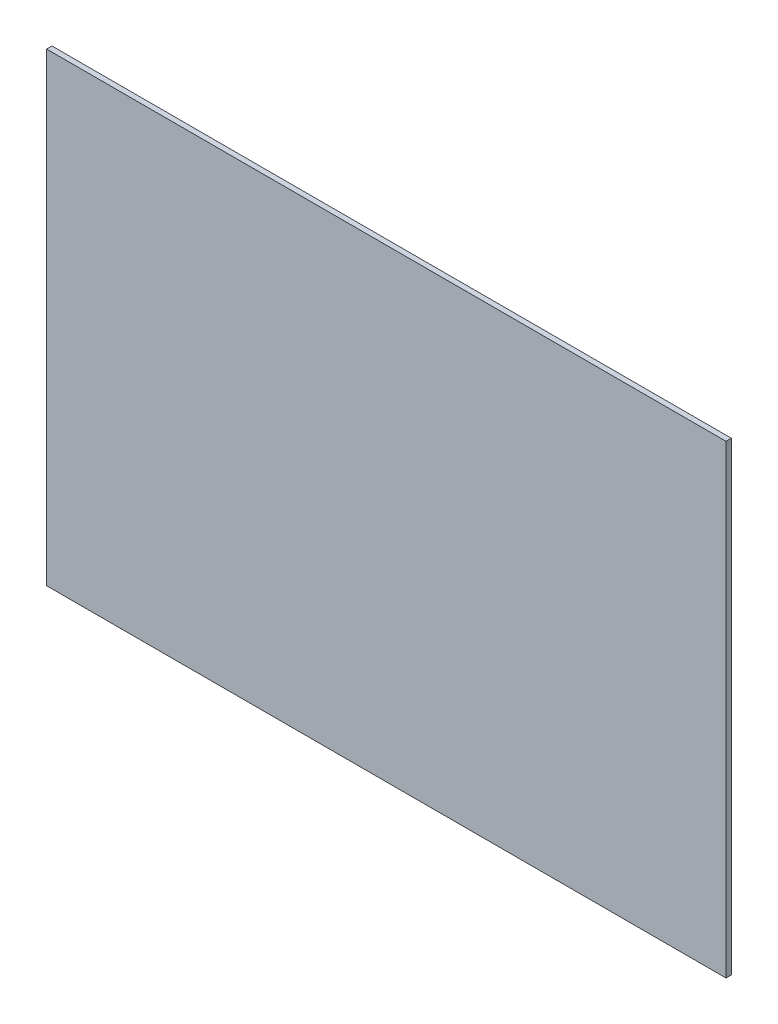
ISO-10303-21;
HEADER;
FILE_DESCRIPTION(('STEP AP214'),'2;1');
FILE_NAME('part.step','',(''),(''),'','','');
FILE_SCHEMA(('AUTOMOTIVE_DESIGN { 1 0 10303 214 1 1 1 1 }'));
ENDSEC;
DATA;
#1=APPLICATION_CONTEXT('core data for automotive mechanical design processes');
#2=APPLICATION_PROTOCOL_DEFINITION('international standard','automotive_design',2000,#1);
#3=PRODUCT_CONTEXT('',#1,'mechanical');
#4=PRODUCT('Part','Part','',(#3));
#5=PRODUCT_RELATED_PRODUCT_CATEGORY('part','',(#4));
#6=PRODUCT_DEFINITION_FORMATION('','',#4);
#7=PRODUCT_DEFINITION_CONTEXT('part definition',#1,'design');
#8=PRODUCT_DEFINITION('design','',#6,#7);
#9=PRODUCT_DEFINITION_SHAPE('','',#8);
#10=(LENGTH_UNIT() NAMED_UNIT(*) SI_UNIT(.MILLI.,.METRE.));
#11=(NAMED_UNIT(*) PLANE_ANGLE_UNIT() SI_UNIT($,.RADIAN.));
#12=(NAMED_UNIT(*) SI_UNIT($,.STERADIAN.) SOLID_ANGLE_UNIT());
#13=UNCERTAINTY_MEASURE_WITH_UNIT(LENGTH_MEASURE(1.E-05),#10,'distance_accuracy_value','');
#14=(GEOMETRIC_REPRESENTATION_CONTEXT(3) GLOBAL_UNCERTAINTY_ASSIGNED_CONTEXT((#13)) GLOBAL_UNIT_ASSIGNED_CONTEXT((#10,
#11,#12)) REPRESENTATION_CONTEXT('',''));
#15=CARTESIAN_POINT('',(0.,0.,0.));
#16=DIRECTION('',(0.,0.,1.));
#17=DIRECTION('',(1.,0.,0.));
#18=AXIS2_PLACEMENT_3D('',#15,#16,#17);
#19=CARTESIAN_POINT('',(0.,0.,3.));
#20=DIRECTION('',(1.,0.,0.));
#21=DIRECTION('',(0.,0.,-1.));
#22=AXIS2_PLACEMENT_3D('',#19,#20,#21);
#23=PLANE('',#22);
#24=DIRECTION('',(0.,-1.,0.));
#25=VECTOR('',#24,1.);
#26=CARTESIAN_POINT('',(0.,0.,0.));
#27=LINE('',#26,#25);
#28=CARTESIAN_POINT('',(0.,261.3,0.));
#29=VERTEX_POINT('',#28);
#30=CARTESIAN_POINT('',(0.,0.,0.));
#31=VERTEX_POINT('',#30);
#32=EDGE_CURVE('E96',#29,#31,#27,.T.);
#33=ORIENTED_EDGE('',*,*,#32,.T.);
#34=DIRECTION('',(0.,0.,-1.));
#35=VECTOR('',#34,1.);
#36=CARTESIAN_POINT('',(0.,0.,3.));
#37=LINE('',#36,#35);
#38=CARTESIAN_POINT('',(0.,0.,3.));
#39=VERTEX_POINT('',#38);
#40=EDGE_CURVE('E11',#39,#31,#37,.T.);
#41=ORIENTED_EDGE('',*,*,#40,.F.);
#42=DIRECTION('',(0.,-1.,0.));
#43=VECTOR('',#42,1.);
#44=CARTESIAN_POINT('',(0.,0.,3.));
#45=LINE('',#44,#43);
#46=CARTESIAN_POINT('',(0.,261.3,3.));
#47=VERTEX_POINT('',#46);
#48=EDGE_CURVE('E84',#47,#39,#45,.T.);
#49=ORIENTED_EDGE('',*,*,#48,.F.);
#50=DIRECTION('',(0.,0.,-1.));
#51=VECTOR('',#50,1.);
#52=CARTESIAN_POINT('',(0.,261.3,3.));
#53=LINE('',#52,#51);
#54=EDGE_CURVE('E92',#47,#29,#53,.T.);
#55=ORIENTED_EDGE('',*,*,#54,.T.);
#56=EDGE_LOOP('',(#33,#41,#49,#55));
#57=FACE_BOUND('',#56,.T.);
#58=ADVANCED_FACE('F33',(#57),#23,.F.);
#59=CARTESIAN_POINT('',(0.,0.,3.));
#60=DIRECTION('',(0.,1.,0.));
#61=DIRECTION('',(0.,0.,1.));
#62=AXIS2_PLACEMENT_3D('',#59,#60,#61);
#63=PLANE('',#62);
#64=DIRECTION('',(1.,0.,0.));
#65=VECTOR('',#64,1.);
#66=CARTESIAN_POINT('',(0.,0.,0.));
#67=LINE('',#66,#65);
#68=CARTESIAN_POINT('',(381.9,0.,0.));
#69=VERTEX_POINT('',#68);
#70=EDGE_CURVE('E88',#31,#69,#67,.T.);
#71=ORIENTED_EDGE('',*,*,#70,.T.);
#72=DIRECTION('',(0.,0.,-1.));
#73=VECTOR('',#72,1.);
#74=CARTESIAN_POINT('',(381.9,0.,3.));
#75=LINE('',#74,#73);
#76=CARTESIAN_POINT('',(381.9,0.,3.));
#77=VERTEX_POINT('',#76);
#78=EDGE_CURVE('E41',#77,#69,#75,.T.);
#79=ORIENTED_EDGE('',*,*,#78,.F.);
#80=DIRECTION('',(1.,0.,0.));
#81=VECTOR('',#80,1.);
#82=CARTESIAN_POINT('',(0.,0.,3.));
#83=LINE('',#82,#81);
#84=EDGE_CURVE('E79',#39,#77,#83,.T.);
#85=ORIENTED_EDGE('',*,*,#84,.F.);
#86=ORIENTED_EDGE('',*,*,#40,.T.);
#87=EDGE_LOOP('',(#71,#79,#85,#86));
#88=FACE_BOUND('',#87,.T.);
#89=ADVANCED_FACE('F87',(#88),#63,.F.);
#90=CARTESIAN_POINT('',(381.9,0.,3.));
#91=DIRECTION('',(-1.,0.,0.));
#92=DIRECTION('',(0.,0.,1.));
#93=AXIS2_PLACEMENT_3D('',#90,#91,#92);
#94=PLANE('',#93);
#95=DIRECTION('',(0.,1.,0.));
#96=VECTOR('',#95,1.);
#97=CARTESIAN_POINT('',(381.9,0.,0.));
#98=LINE('',#97,#96);
#99=CARTESIAN_POINT('',(381.9,261.3,0.));
#100=VERTEX_POINT('',#99);
#101=EDGE_CURVE('E66',#69,#100,#98,.T.);
#102=ORIENTED_EDGE('',*,*,#101,.T.);
#103=DIRECTION('',(0.,0.,-1.));
#104=VECTOR('',#103,1.);
#105=CARTESIAN_POINT('',(381.9,261.3,3.));
#106=LINE('',#105,#104);
#107=CARTESIAN_POINT('',(381.9,261.3,3.));
#108=VERTEX_POINT('',#107);
#109=EDGE_CURVE('E89',#108,#100,#106,.T.);
#110=ORIENTED_EDGE('',*,*,#109,.F.);
#111=DIRECTION('',(0.,1.,0.));
#112=VECTOR('',#111,1.);
#113=CARTESIAN_POINT('',(381.9,0.,3.));
#114=LINE('',#113,#112);
#115=EDGE_CURVE('E82',#77,#108,#114,.T.);
#116=ORIENTED_EDGE('',*,*,#115,.F.);
#117=ORIENTED_EDGE('',*,*,#78,.T.);
#118=EDGE_LOOP('',(#102,#110,#116,#117));
#119=FACE_BOUND('',#118,.T.);
#120=ADVANCED_FACE('F90',(#119),#94,.F.);
#121=CARTESIAN_POINT('',(0.,261.3,3.));
#122=DIRECTION('',(0.,-1.,0.));
#123=DIRECTION('',(0.,0.,-1.));
#124=AXIS2_PLACEMENT_3D('',#121,#122,#123);
#125=PLANE('',#124);
#126=DIRECTION('',(-1.,0.,0.));
#127=VECTOR('',#126,1.);
#128=CARTESIAN_POINT('',(0.,261.3,0.));
#129=LINE('',#128,#127);
#130=EDGE_CURVE('E72',#100,#29,#129,.T.);
#131=ORIENTED_EDGE('',*,*,#130,.T.);
#132=ORIENTED_EDGE('',*,*,#54,.F.);
#133=DIRECTION('',(-1.,0.,0.));
#134=VECTOR('',#133,1.);
#135=CARTESIAN_POINT('',(0.,261.3,3.));
#136=LINE('',#135,#134);
#137=EDGE_CURVE('E49',#108,#47,#136,.T.);
#138=ORIENTED_EDGE('',*,*,#137,.F.);
#139=ORIENTED_EDGE('',*,*,#109,.T.);
#140=EDGE_LOOP('',(#131,#132,#138,#139));
#141=FACE_BOUND('',#140,.T.);
#142=ADVANCED_FACE('F103',(#141),#125,.F.);
#143=CARTESIAN_POINT('',(0.,0.,3.));
#144=DIRECTION('',(0.,0.,-1.));
#145=DIRECTION('',(-1.,0.,0.));
#146=AXIS2_PLACEMENT_3D('',#143,#144,#145);
#147=PLANE('',#146);
#148=ORIENTED_EDGE('',*,*,#48,.T.);
#149=ORIENTED_EDGE('',*,*,#84,.T.);
#150=ORIENTED_EDGE('',*,*,#115,.T.);
#151=ORIENTED_EDGE('',*,*,#137,.T.);
#152=EDGE_LOOP('',(#148,#149,#150,#151));
#153=FACE_BOUND('',#152,.T.);
#154=ADVANCED_FACE('F80',(#153),#147,.F.);
#155=CARTESIAN_POINT('',(0.,0.,0.));
#156=DIRECTION('',(0.,0.,-1.));
#157=DIRECTION('',(-1.,0.,0.));
#158=AXIS2_PLACEMENT_3D('',#155,#156,#157);
#159=PLANE('',#158);
#160=ORIENTED_EDGE('',*,*,#32,.F.);
#161=ORIENTED_EDGE('',*,*,#130,.F.);
#162=ORIENTED_EDGE('',*,*,#101,.F.);
#163=ORIENTED_EDGE('',*,*,#70,.F.);
#164=EDGE_LOOP('',(#160,#161,#162,#163));
#165=FACE_BOUND('',#164,.T.);
#166=ADVANCED_FACE('F106',(#165),#159,.T.);
#167=CLOSED_SHELL('',(#58,#89,#120,#142,#154,#166));
#168=MANIFOLD_SOLID_BREP('B2',#167);
#169=ADVANCED_BREP_SHAPE_REPRESENTATION('',(#18,#168),#14);
#170=SHAPE_DEFINITION_REPRESENTATION(#9,#169);
ENDSEC;
END-ISO-10303-21;
